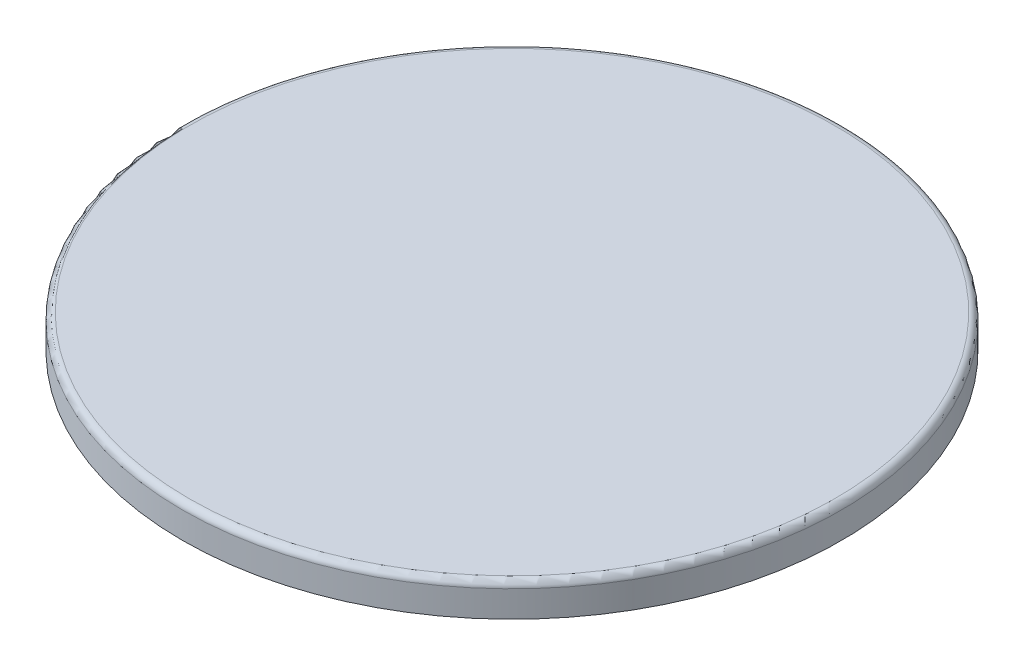
ISO-10303-21;
HEADER;
FILE_DESCRIPTION(('STEP AP214'),'2;1');
FILE_NAME('part.step','',(''),(''),'','','');
FILE_SCHEMA(('AUTOMOTIVE_DESIGN { 1 0 10303 214 1 1 1 1 }'));
ENDSEC;
DATA;
#1=APPLICATION_CONTEXT('core data for automotive mechanical design processes');
#2=APPLICATION_PROTOCOL_DEFINITION('international standard','automotive_design',2000,#1);
#3=PRODUCT_CONTEXT('',#1,'mechanical');
#4=PRODUCT('Part','Part','',(#3));
#5=PRODUCT_RELATED_PRODUCT_CATEGORY('part','',(#4));
#6=PRODUCT_DEFINITION_FORMATION('','',#4);
#7=PRODUCT_DEFINITION_CONTEXT('part definition',#1,'design');
#8=PRODUCT_DEFINITION('design','',#6,#7);
#9=PRODUCT_DEFINITION_SHAPE('','',#8);
#10=(LENGTH_UNIT() NAMED_UNIT(*) SI_UNIT(.MILLI.,.METRE.));
#11=(NAMED_UNIT(*) PLANE_ANGLE_UNIT() SI_UNIT($,.RADIAN.));
#12=(NAMED_UNIT(*) SI_UNIT($,.STERADIAN.) SOLID_ANGLE_UNIT());
#13=UNCERTAINTY_MEASURE_WITH_UNIT(LENGTH_MEASURE(1.E-05),#10,'distance_accuracy_value','');
#14=(GEOMETRIC_REPRESENTATION_CONTEXT(3) GLOBAL_UNCERTAINTY_ASSIGNED_CONTEXT((#13)) GLOBAL_UNIT_ASSIGNED_CONTEXT((#10,
#11,#12)) REPRESENTATION_CONTEXT('',''));
#15=CARTESIAN_POINT('',(0.,0.,0.));
#16=DIRECTION('',(0.,0.,1.));
#17=DIRECTION('',(1.,0.,0.));
#18=AXIS2_PLACEMENT_3D('',#15,#16,#17);
#19=CARTESIAN_POINT('',(0.,0.5,0.));
#20=DIRECTION('',(0.,-1.,0.));
#21=DIRECTION('',(0.,0.,-1.));
#22=AXIS2_PLACEMENT_3D('',#19,#20,#21);
#23=CYLINDRICAL_SURFACE('',#22,5.);
#24=CARTESIAN_POINT('',(0.,0.4,0.));
#25=DIRECTION('',(0.,1.,0.));
#26=DIRECTION('',(0.,0.,1.));
#27=AXIS2_PLACEMENT_3D('',#24,#25,#26);
#28=CIRCLE('',#27,5.);
#29=CARTESIAN_POINT('',(0.,0.4,5.));
#30=VERTEX_POINT('',#29);
#31=EDGE_CURVE('E10',#30,#30,#28,.F.);
#32=ORIENTED_EDGE('',*,*,#31,.T.);
#33=EDGE_LOOP('',(#32));
#34=FACE_BOUND('',#33,.T.);
#35=CARTESIAN_POINT('',(0.,0.,0.));
#36=DIRECTION('',(0.,1.,0.));
#37=DIRECTION('',(0.,0.,1.));
#38=AXIS2_PLACEMENT_3D('',#35,#36,#37);
#39=CIRCLE('',#38,5.);
#40=CARTESIAN_POINT('',(0.,0.,5.));
#41=VERTEX_POINT('',#40);
#42=EDGE_CURVE('E44',#41,#41,#39,.T.);
#43=ORIENTED_EDGE('',*,*,#42,.T.);
#44=EDGE_LOOP('',(#43));
#45=FACE_BOUND('',#44,.T.);
#46=ADVANCED_FACE('F33',(#34,#45),#23,.T.);
#47=CARTESIAN_POINT('',(0.,0.5,0.));
#48=DIRECTION('',(0.,1.,0.));
#49=DIRECTION('',(0.,0.,1.));
#50=AXIS2_PLACEMENT_3D('',#47,#48,#49);
#51=PLANE('',#50);
#52=CARTESIAN_POINT('',(0.,0.5,0.));
#53=DIRECTION('',(0.,1.,0.));
#54=DIRECTION('',(0.,0.,1.));
#55=AXIS2_PLACEMENT_3D('',#52,#53,#54);
#56=CIRCLE('',#55,4.9);
#57=CARTESIAN_POINT('',(0.,0.5,4.9));
#58=VERTEX_POINT('',#57);
#59=EDGE_CURVE('E40',#58,#58,#56,.T.);
#60=ORIENTED_EDGE('',*,*,#59,.T.);
#61=EDGE_LOOP('',(#60));
#62=FACE_BOUND('',#61,.T.);
#63=ADVANCED_FACE('F54',(#62),#51,.T.);
#64=CARTESIAN_POINT('',(0.,0.,0.));
#65=DIRECTION('',(0.,1.,0.));
#66=DIRECTION('',(0.,0.,1.));
#67=AXIS2_PLACEMENT_3D('',#64,#65,#66);
#68=PLANE('',#67);
#69=ORIENTED_EDGE('',*,*,#42,.F.);
#70=EDGE_LOOP('',(#69));
#71=FACE_BOUND('',#70,.T.);
#72=ADVANCED_FACE('F52',(#71),#68,.F.);
#73=CARTESIAN_POINT('',(0.,0.4,0.));
#74=DIRECTION('',(0.,1.,0.));
#75=DIRECTION('',(0.,0.,1.));
#76=AXIS2_PLACEMENT_3D('',#73,#74,#75);
#77=TOROIDAL_SURFACE('',#76,4.9,0.1);
#78=ORIENTED_EDGE('',*,*,#31,.F.);
#79=EDGE_LOOP('',(#78));
#80=FACE_BOUND('',#79,.T.);
#81=ORIENTED_EDGE('',*,*,#59,.F.);
#82=EDGE_LOOP('',(#81));
#83=FACE_BOUND('',#82,.T.);
#84=ADVANCED_FACE('F35',(#80,#83),#77,.T.);
#85=CLOSED_SHELL('',(#46,#63,#72,#84));
#86=MANIFOLD_SOLID_BREP('B2',#85);
#87=ADVANCED_BREP_SHAPE_REPRESENTATION('',(#18,#86),#14);
#88=SHAPE_DEFINITION_REPRESENTATION(#9,#87);
ENDSEC;
END-ISO-10303-21;
